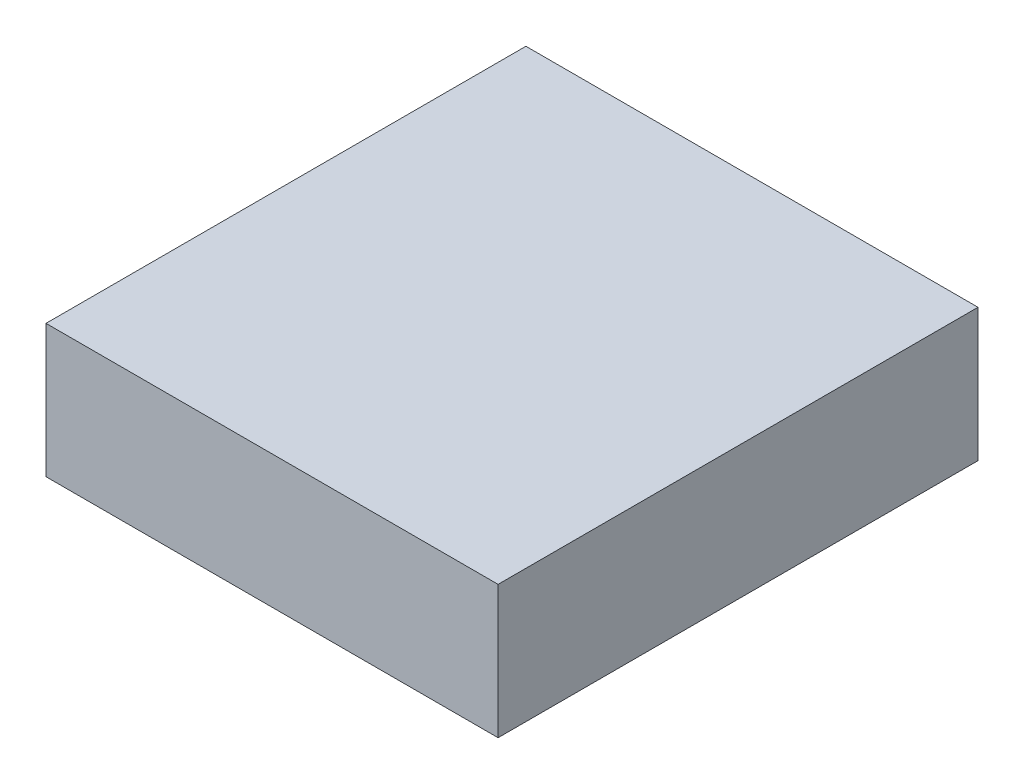
ISO-10303-21;
HEADER;
FILE_DESCRIPTION(('STEP AP214'),'2;1');
FILE_NAME('part.step','',(''),(''),'','','');
FILE_SCHEMA(('AUTOMOTIVE_DESIGN { 1 0 10303 214 1 1 1 1 }'));
ENDSEC;
DATA;
#1=APPLICATION_CONTEXT('core data for automotive mechanical design processes');
#2=APPLICATION_PROTOCOL_DEFINITION('international standard','automotive_design',2000,#1);
#3=PRODUCT_CONTEXT('',#1,'mechanical');
#4=PRODUCT('Part','Part','',(#3));
#5=PRODUCT_RELATED_PRODUCT_CATEGORY('part','',(#4));
#6=PRODUCT_DEFINITION_FORMATION('','',#4);
#7=PRODUCT_DEFINITION_CONTEXT('part definition',#1,'design');
#8=PRODUCT_DEFINITION('design','',#6,#7);
#9=PRODUCT_DEFINITION_SHAPE('','',#8);
#10=(LENGTH_UNIT() NAMED_UNIT(*) SI_UNIT(.MILLI.,.METRE.));
#11=(NAMED_UNIT(*) PLANE_ANGLE_UNIT() SI_UNIT($,.RADIAN.));
#12=(NAMED_UNIT(*) SI_UNIT($,.STERADIAN.) SOLID_ANGLE_UNIT());
#13=UNCERTAINTY_MEASURE_WITH_UNIT(LENGTH_MEASURE(1.E-05),#10,'distance_accuracy_value','');
#14=(GEOMETRIC_REPRESENTATION_CONTEXT(3) GLOBAL_UNCERTAINTY_ASSIGNED_CONTEXT((#13)) GLOBAL_UNIT_ASSIGNED_CONTEXT((#10,
#11,#12)) REPRESENTATION_CONTEXT('',''));
#15=CARTESIAN_POINT('',(0.,0.,0.));
#16=DIRECTION('',(0.,0.,1.));
#17=DIRECTION('',(1.,0.,0.));
#18=AXIS2_PLACEMENT_3D('',#15,#16,#17);
#19=CARTESIAN_POINT('',(32.5,-9.55,69.));
#20=DIRECTION('',(-1.,0.,0.));
#21=DIRECTION('',(0.,0.,1.));
#22=AXIS2_PLACEMENT_3D('',#19,#20,#21);
#23=PLANE('',#22);
#24=DIRECTION('',(0.,1.,0.));
#25=VECTOR('',#24,1.);
#26=CARTESIAN_POINT('',(32.5,-9.55,0.));
#27=LINE('',#26,#25);
#28=CARTESIAN_POINT('',(32.5,-9.55,0.));
#29=VERTEX_POINT('',#28);
#30=CARTESIAN_POINT('',(32.5,9.55,0.));
#31=VERTEX_POINT('',#30);
#32=EDGE_CURVE('E96',#29,#31,#27,.T.);
#33=ORIENTED_EDGE('',*,*,#32,.T.);
#34=DIRECTION('',(0.,0.,-1.));
#35=VECTOR('',#34,1.);
#36=CARTESIAN_POINT('',(32.5,9.55,69.));
#37=LINE('',#36,#35);
#38=CARTESIAN_POINT('',(32.5,9.55,69.));
#39=VERTEX_POINT('',#38);
#40=EDGE_CURVE('E11',#39,#31,#37,.T.);
#41=ORIENTED_EDGE('',*,*,#40,.F.);
#42=DIRECTION('',(0.,1.,0.));
#43=VECTOR('',#42,1.);
#44=CARTESIAN_POINT('',(32.5,-9.55,69.));
#45=LINE('',#44,#43);
#46=CARTESIAN_POINT('',(32.5,-9.55,69.));
#47=VERTEX_POINT('',#46);
#48=EDGE_CURVE('E84',#47,#39,#45,.T.);
#49=ORIENTED_EDGE('',*,*,#48,.F.);
#50=DIRECTION('',(0.,0.,-1.));
#51=VECTOR('',#50,1.);
#52=CARTESIAN_POINT('',(32.5,-9.55,69.));
#53=LINE('',#52,#51);
#54=EDGE_CURVE('E92',#47,#29,#53,.T.);
#55=ORIENTED_EDGE('',*,*,#54,.T.);
#56=EDGE_LOOP('',(#33,#41,#49,#55));
#57=FACE_BOUND('',#56,.T.);
#58=ADVANCED_FACE('F33',(#57),#23,.F.);
#59=CARTESIAN_POINT('',(-32.5,9.55,69.));
#60=DIRECTION('',(0.,-1.,0.));
#61=DIRECTION('',(0.,0.,-1.));
#62=AXIS2_PLACEMENT_3D('',#59,#60,#61);
#63=PLANE('',#62);
#64=DIRECTION('',(-1.,0.,0.));
#65=VECTOR('',#64,1.);
#66=CARTESIAN_POINT('',(-32.5,9.55,0.));
#67=LINE('',#66,#65);
#68=CARTESIAN_POINT('',(-32.5,9.55,0.));
#69=VERTEX_POINT('',#68);
#70=EDGE_CURVE('E88',#31,#69,#67,.T.);
#71=ORIENTED_EDGE('',*,*,#70,.T.);
#72=DIRECTION('',(0.,0.,-1.));
#73=VECTOR('',#72,1.);
#74=CARTESIAN_POINT('',(-32.5,9.55,69.));
#75=LINE('',#74,#73);
#76=CARTESIAN_POINT('',(-32.5,9.55,69.));
#77=VERTEX_POINT('',#76);
#78=EDGE_CURVE('E41',#77,#69,#75,.T.);
#79=ORIENTED_EDGE('',*,*,#78,.F.);
#80=DIRECTION('',(-1.,0.,0.));
#81=VECTOR('',#80,1.);
#82=CARTESIAN_POINT('',(-32.5,9.55,69.));
#83=LINE('',#82,#81);
#84=EDGE_CURVE('E79',#39,#77,#83,.T.);
#85=ORIENTED_EDGE('',*,*,#84,.F.);
#86=ORIENTED_EDGE('',*,*,#40,.T.);
#87=EDGE_LOOP('',(#71,#79,#85,#86));
#88=FACE_BOUND('',#87,.T.);
#89=ADVANCED_FACE('F87',(#88),#63,.F.);
#90=CARTESIAN_POINT('',(-32.5,-9.55,69.));
#91=DIRECTION('',(1.,0.,0.));
#92=DIRECTION('',(0.,0.,-1.));
#93=AXIS2_PLACEMENT_3D('',#90,#91,#92);
#94=PLANE('',#93);
#95=DIRECTION('',(0.,-1.,0.));
#96=VECTOR('',#95,1.);
#97=CARTESIAN_POINT('',(-32.5,-9.55,0.));
#98=LINE('',#97,#96);
#99=CARTESIAN_POINT('',(-32.5,-9.55,0.));
#100=VERTEX_POINT('',#99);
#101=EDGE_CURVE('E66',#69,#100,#98,.T.);
#102=ORIENTED_EDGE('',*,*,#101,.T.);
#103=DIRECTION('',(0.,0.,-1.));
#104=VECTOR('',#103,1.);
#105=CARTESIAN_POINT('',(-32.5,-9.55,69.));
#106=LINE('',#105,#104);
#107=CARTESIAN_POINT('',(-32.5,-9.55,69.));
#108=VERTEX_POINT('',#107);
#109=EDGE_CURVE('E89',#108,#100,#106,.T.);
#110=ORIENTED_EDGE('',*,*,#109,.F.);
#111=DIRECTION('',(0.,-1.,0.));
#112=VECTOR('',#111,1.);
#113=CARTESIAN_POINT('',(-32.5,-9.55,69.));
#114=LINE('',#113,#112);
#115=EDGE_CURVE('E82',#77,#108,#114,.T.);
#116=ORIENTED_EDGE('',*,*,#115,.F.);
#117=ORIENTED_EDGE('',*,*,#78,.T.);
#118=EDGE_LOOP('',(#102,#110,#116,#117));
#119=FACE_BOUND('',#118,.T.);
#120=ADVANCED_FACE('F90',(#119),#94,.F.);
#121=CARTESIAN_POINT('',(-32.5,-9.55,69.));
#122=DIRECTION('',(0.,1.,0.));
#123=DIRECTION('',(0.,0.,1.));
#124=AXIS2_PLACEMENT_3D('',#121,#122,#123);
#125=PLANE('',#124);
#126=DIRECTION('',(1.,0.,0.));
#127=VECTOR('',#126,1.);
#128=CARTESIAN_POINT('',(-32.5,-9.55,0.));
#129=LINE('',#128,#127);
#130=EDGE_CURVE('E72',#100,#29,#129,.T.);
#131=ORIENTED_EDGE('',*,*,#130,.T.);
#132=ORIENTED_EDGE('',*,*,#54,.F.);
#133=DIRECTION('',(1.,0.,0.));
#134=VECTOR('',#133,1.);
#135=CARTESIAN_POINT('',(-32.5,-9.55,69.));
#136=LINE('',#135,#134);
#137=EDGE_CURVE('E49',#108,#47,#136,.T.);
#138=ORIENTED_EDGE('',*,*,#137,.F.);
#139=ORIENTED_EDGE('',*,*,#109,.T.);
#140=EDGE_LOOP('',(#131,#132,#138,#139));
#141=FACE_BOUND('',#140,.T.);
#142=ADVANCED_FACE('F103',(#141),#125,.F.);
#143=CARTESIAN_POINT('',(0.,0.,69.));
#144=DIRECTION('',(0.,0.,-1.));
#145=DIRECTION('',(-1.,0.,0.));
#146=AXIS2_PLACEMENT_3D('',#143,#144,#145);
#147=PLANE('',#146);
#148=ORIENTED_EDGE('',*,*,#48,.T.);
#149=ORIENTED_EDGE('',*,*,#84,.T.);
#150=ORIENTED_EDGE('',*,*,#115,.T.);
#151=ORIENTED_EDGE('',*,*,#137,.T.);
#152=EDGE_LOOP('',(#148,#149,#150,#151));
#153=FACE_BOUND('',#152,.T.);
#154=ADVANCED_FACE('F80',(#153),#147,.F.);
#155=CARTESIAN_POINT('',(0.,0.,0.));
#156=DIRECTION('',(0.,0.,-1.));
#157=DIRECTION('',(-1.,0.,0.));
#158=AXIS2_PLACEMENT_3D('',#155,#156,#157);
#159=PLANE('',#158);
#160=ORIENTED_EDGE('',*,*,#32,.F.);
#161=ORIENTED_EDGE('',*,*,#130,.F.);
#162=ORIENTED_EDGE('',*,*,#101,.F.);
#163=ORIENTED_EDGE('',*,*,#70,.F.);
#164=EDGE_LOOP('',(#160,#161,#162,#163));
#165=FACE_BOUND('',#164,.T.);
#166=ADVANCED_FACE('F106',(#165),#159,.T.);
#167=CLOSED_SHELL('',(#58,#89,#120,#142,#154,#166));
#168=MANIFOLD_SOLID_BREP('B2',#167);
#169=ADVANCED_BREP_SHAPE_REPRESENTATION('',(#18,#168),#14);
#170=SHAPE_DEFINITION_REPRESENTATION(#9,#169);
ENDSEC;
END-ISO-10303-21;
